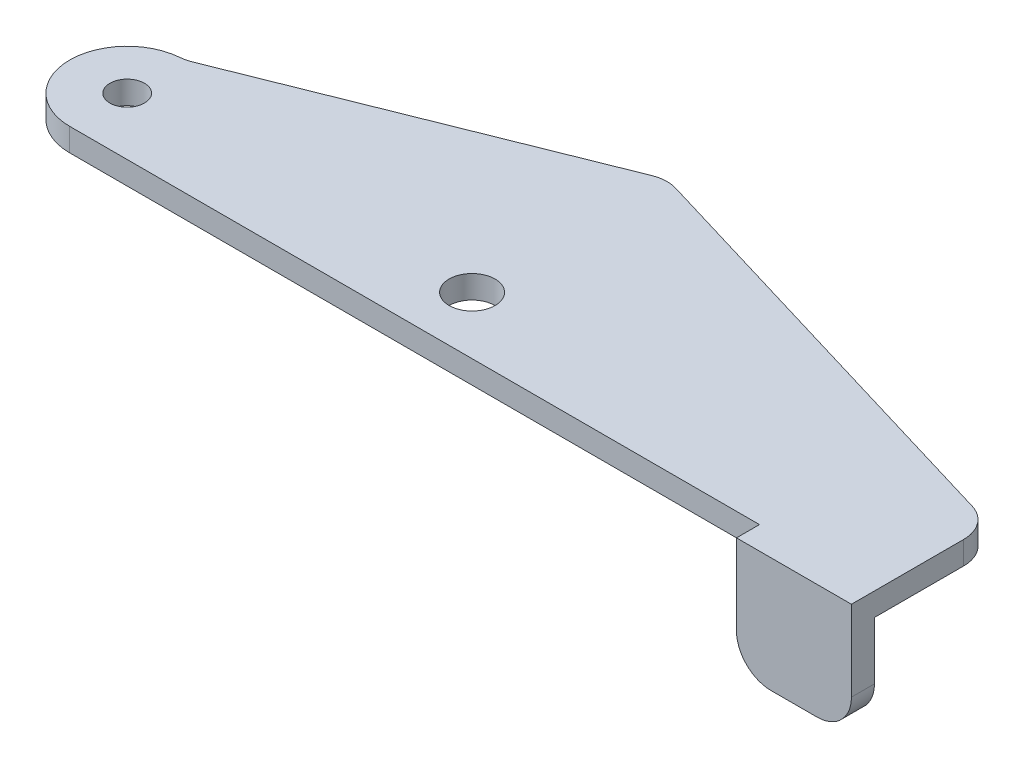
ISO-10303-21;
HEADER;
FILE_DESCRIPTION(('STEP AP214'),'2;1');
FILE_NAME('part.step','',(''),(''),'','','');
FILE_SCHEMA(('AUTOMOTIVE_DESIGN { 1 0 10303 214 1 1 1 1 }'));
ENDSEC;
DATA;
#1=APPLICATION_CONTEXT('core data for automotive mechanical design processes');
#2=APPLICATION_PROTOCOL_DEFINITION('international standard','automotive_design',2000,#1);
#3=PRODUCT_CONTEXT('',#1,'mechanical');
#4=PRODUCT('Part','Part','',(#3));
#5=PRODUCT_RELATED_PRODUCT_CATEGORY('part','',(#4));
#6=PRODUCT_DEFINITION_FORMATION('','',#4);
#7=PRODUCT_DEFINITION_CONTEXT('part definition',#1,'design');
#8=PRODUCT_DEFINITION('design','',#6,#7);
#9=PRODUCT_DEFINITION_SHAPE('','',#8);
#10=(LENGTH_UNIT() NAMED_UNIT(*) SI_UNIT(.MILLI.,.METRE.));
#11=(NAMED_UNIT(*) PLANE_ANGLE_UNIT() SI_UNIT($,.RADIAN.));
#12=(NAMED_UNIT(*) SI_UNIT($,.STERADIAN.) SOLID_ANGLE_UNIT());
#13=UNCERTAINTY_MEASURE_WITH_UNIT(LENGTH_MEASURE(1.E-05),#10,'distance_accuracy_value','');
#14=(GEOMETRIC_REPRESENTATION_CONTEXT(3) GLOBAL_UNCERTAINTY_ASSIGNED_CONTEXT((#13)) GLOBAL_UNIT_ASSIGNED_CONTEXT((#10,
#11,#12)) REPRESENTATION_CONTEXT('',''));
#15=CARTESIAN_POINT('',(0.,0.,0.));
#16=DIRECTION('',(0.,0.,1.));
#17=DIRECTION('',(1.,0.,0.));
#18=AXIS2_PLACEMENT_3D('',#15,#16,#17);
#19=CARTESIAN_POINT('',(-30.,2.,0.));
#20=DIRECTION('',(0.,1.,0.));
#21=DIRECTION('',(0.,0.,1.));
#22=AXIS2_PLACEMENT_3D('',#19,#20,#21);
#23=PLANE('',#22);
#24=CARTESIAN_POINT('',(-30.,2.,0.));
#25=DIRECTION('',(0.,1.,0.));
#26=DIRECTION('',(0.,0.,1.));
#27=AXIS2_PLACEMENT_3D('',#24,#25,#26);
#28=CIRCLE('',#27,1.5);
#29=CARTESIAN_POINT('',(-30.,2.,1.49999999999993));
#30=VERTEX_POINT('',#29);
#31=EDGE_CURVE('E181',#30,#30,#28,.T.);
#32=ORIENTED_EDGE('',*,*,#31,.F.);
#33=EDGE_LOOP('',(#32));
#34=FACE_BOUND('',#33,.T.);
#35=DIRECTION('',(0.,0.,-1.));
#36=VECTOR('',#35,1.);
#37=CARTESIAN_POINT('',(40.,2.,-5.00000000000006));
#38=LINE('',#37,#36);
#39=CARTESIAN_POINT('',(40.,2.,6.99999999999992));
#40=VERTEX_POINT('',#39);
#41=CARTESIAN_POINT('',(40.,2.,-2.76790804732689));
#42=VERTEX_POINT('',#41);
#43=EDGE_CURVE('E165',#40,#42,#38,.T.);
#44=ORIENTED_EDGE('',*,*,#43,.T.);
#45=CARTESIAN_POINT('',(37.,2.,-2.76790804732689));
#46=DIRECTION('',(0.,1.,0.));
#47=DIRECTION('',(0.,0.,1.));
#48=AXIS2_PLACEMENT_3D('',#45,#46,#47);
#49=CIRCLE('',#48,3.);
#50=CARTESIAN_POINT('',(37.862043656699,2.,-5.64138690299035));
#51=VERTEX_POINT('',#50);
#52=EDGE_CURVE('E213',#42,#51,#49,.T.);
#53=ORIENTED_EDGE('',*,*,#52,.T.);
#54=DIRECTION('',(-0.957826285221152,0.,-0.287347885566344));
#55=VECTOR('',#54,1.);
#56=CARTESIAN_POINT('',(0.,2.,-17.));
#57=LINE('',#56,#55);
#58=CARTESIAN_POINT('',(1.0034821304241,2.,-16.6989553608728));
#59=VERTEX_POINT('',#58);
#60=EDGE_CURVE('E167',#51,#59,#57,.T.);
#61=ORIENTED_EDGE('',*,*,#60,.T.);
#62=CARTESIAN_POINT('',(0.141438473725063,2.,-13.8254765052093));
#63=DIRECTION('',(0.,1.,0.));
#64=DIRECTION('',(0.,0.,1.));
#65=AXIS2_PLACEMENT_3D('',#62,#63,#64);
#66=CIRCLE('',#65,3.);
#67=CARTESIAN_POINT('',(-0.972733555337238,2.,-16.6109065778651));
#68=VERTEX_POINT('',#67);
#69=EDGE_CURVE('E211',#59,#68,#66,.T.);
#70=ORIENTED_EDGE('',*,*,#69,.T.);
#71=DIRECTION('',(-0.92847669088526,0.,0.371390676354102));
#72=VECTOR('',#71,1.);
#73=CARTESIAN_POINT('',(-30.,2.,-5.00000000000005));
#74=LINE('',#73,#72);
#75=CARTESIAN_POINT('',(-29.5281433139647,2.,-5.18874267441416));
#76=VERTEX_POINT('',#75);
#77=EDGE_CURVE('E175',#68,#76,#74,.T.);
#78=ORIENTED_EDGE('',*,*,#77,.T.);
#79=CARTESIAN_POINT('',(-30.642315343027,2.,-7.97417274706994));
#80=DIRECTION('',(0.,1.,0.));
#81=DIRECTION('',(0.,0.,1.));
#82=AXIS2_PLACEMENT_3D('',#79,#80,#81);
#83=CIRCLE('',#82,3.);
#84=CARTESIAN_POINT('',(-30.4014470893919,2.,-4.98385796691873));
#85=VERTEX_POINT('',#84);
#86=EDGE_CURVE('E217',#76,#85,#83,.F.);
#87=ORIENTED_EDGE('',*,*,#86,.T.);
#88=CARTESIAN_POINT('',(-30.,2.,0.));
#89=DIRECTION('',(0.,1.,0.));
#90=DIRECTION('',(0.,0.,1.));
#91=AXIS2_PLACEMENT_3D('',#88,#89,#90);
#92=CIRCLE('',#91,4.99999999999999);
#93=CARTESIAN_POINT('',(-30.,2.,4.99999999999992));
#94=VERTEX_POINT('',#93);
#95=EDGE_CURVE('E164',#85,#94,#92,.T.);
#96=ORIENTED_EDGE('',*,*,#95,.T.);
#97=DIRECTION('',(1.,0.,0.));
#98=VECTOR('',#97,1.);
#99=CARTESIAN_POINT('',(40.,2.,4.99999999999994));
#100=LINE('',#99,#98);
#101=CARTESIAN_POINT('',(30.,2.,4.99999999999992));
#102=VERTEX_POINT('',#101);
#103=EDGE_CURVE('E154',#94,#102,#100,.T.);
#104=ORIENTED_EDGE('',*,*,#103,.T.);
#105=DIRECTION('',(0.,0.,1.));
#106=VECTOR('',#105,1.);
#107=CARTESIAN_POINT('',(30.,2.,4.99999999999992));
#108=LINE('',#107,#106);
#109=CARTESIAN_POINT('',(30.,2.,6.99999999999992));
#110=VERTEX_POINT('',#109);
#111=EDGE_CURVE('E135',#102,#110,#108,.T.);
#112=ORIENTED_EDGE('',*,*,#111,.T.);
#113=DIRECTION('',(1.,0.,0.));
#114=VECTOR('',#113,1.);
#115=CARTESIAN_POINT('',(40.,2.,6.99999999999992));
#116=LINE('',#115,#114);
#117=EDGE_CURVE('E147',#110,#40,#116,.T.);
#118=ORIENTED_EDGE('',*,*,#117,.T.);
#119=EDGE_LOOP('',(#44,#53,#61,#70,#78,#87,#96,#104,#112,#118));
#120=FACE_BOUND('',#119,.T.);
#121=CARTESIAN_POINT('',(0.,2.,0.));
#122=DIRECTION('',(0.,1.,0.));
#123=DIRECTION('',(0.,0.,1.));
#124=AXIS2_PLACEMENT_3D('',#121,#122,#123);
#125=CIRCLE('',#124,2.);
#126=CARTESIAN_POINT('',(0.,2.,2.));
#127=VERTEX_POINT('',#126);
#128=EDGE_CURVE('E259',#127,#127,#125,.T.);
#129=ORIENTED_EDGE('',*,*,#128,.F.);
#130=EDGE_LOOP('',(#129));
#131=FACE_BOUND('',#130,.T.);
#132=ADVANCED_FACE('F35',(#34,#120,#131),#23,.T.);
#133=CARTESIAN_POINT('',(-30.,0.,0.));
#134=DIRECTION('',(0.,1.,0.));
#135=DIRECTION('',(0.,0.,1.));
#136=AXIS2_PLACEMENT_3D('',#133,#134,#135);
#137=PLANE('',#136);
#138=CARTESIAN_POINT('',(-30.,0.,0.));
#139=DIRECTION('',(0.,1.,0.));
#140=DIRECTION('',(0.,0.,1.));
#141=AXIS2_PLACEMENT_3D('',#138,#139,#140);
#142=CIRCLE('',#141,1.5);
#143=CARTESIAN_POINT('',(-30.,0.,1.49999999999993));
#144=VERTEX_POINT('',#143);
#145=EDGE_CURVE('E262',#144,#144,#142,.T.);
#146=ORIENTED_EDGE('',*,*,#145,.T.);
#147=EDGE_LOOP('',(#146));
#148=FACE_BOUND('',#147,.T.);
#149=DIRECTION('',(-0.957826285221152,0.,-0.287347885566344));
#150=VECTOR('',#149,1.);
#151=CARTESIAN_POINT('',(0.,0.,-17.));
#152=LINE('',#151,#150);
#153=CARTESIAN_POINT('',(37.862043656699,0.,-5.64138690299035));
#154=VERTEX_POINT('',#153);
#155=CARTESIAN_POINT('',(1.0034821304241,0.,-16.6989553608728));
#156=VERTEX_POINT('',#155);
#157=EDGE_CURVE('E186',#154,#156,#152,.T.);
#158=ORIENTED_EDGE('',*,*,#157,.F.);
#159=CARTESIAN_POINT('',(37.,0.,-2.76790804732689));
#160=DIRECTION('',(0.,1.,0.));
#161=DIRECTION('',(0.,0.,1.));
#162=AXIS2_PLACEMENT_3D('',#159,#160,#161);
#163=CIRCLE('',#162,3.);
#164=CARTESIAN_POINT('',(40.,0.,-2.76790804732689));
#165=VERTEX_POINT('',#164);
#166=EDGE_CURVE('E207',#154,#165,#163,.F.);
#167=ORIENTED_EDGE('',*,*,#166,.T.);
#168=DIRECTION('',(0.,0.,-1.));
#169=VECTOR('',#168,1.);
#170=CARTESIAN_POINT('',(40.,0.,-5.00000000000006));
#171=LINE('',#170,#169);
#172=CARTESIAN_POINT('',(40.,0.,4.99999999999994));
#173=VERTEX_POINT('',#172);
#174=EDGE_CURVE('E183',#173,#165,#171,.T.);
#175=ORIENTED_EDGE('',*,*,#174,.F.);
#176=DIRECTION('',(-1.,0.,0.));
#177=VECTOR('',#176,1.);
#178=CARTESIAN_POINT('',(-30.,0.,4.99999999999994));
#179=LINE('',#178,#177);
#180=CARTESIAN_POINT('',(30.,0.,4.99999999999992));
#181=VERTEX_POINT('',#180);
#182=EDGE_CURVE('E241',#173,#181,#179,.T.);
#183=ORIENTED_EDGE('',*,*,#182,.T.);
#184=DIRECTION('',(1.,0.,0.));
#185=VECTOR('',#184,1.);
#186=CARTESIAN_POINT('',(40.,0.,4.99999999999994));
#187=LINE('',#186,#185);
#188=CARTESIAN_POINT('',(-30.,0.,4.99999999999992));
#189=VERTEX_POINT('',#188);
#190=EDGE_CURVE('E157',#189,#181,#187,.T.);
#191=ORIENTED_EDGE('',*,*,#190,.F.);
#192=CARTESIAN_POINT('',(-30.,0.,0.));
#193=DIRECTION('',(0.,1.,0.));
#194=DIRECTION('',(0.,0.,1.));
#195=AXIS2_PLACEMENT_3D('',#192,#193,#194);
#196=CIRCLE('',#195,4.99999999999999);
#197=CARTESIAN_POINT('',(-30.4014470893919,0.,-4.98385796691873));
#198=VERTEX_POINT('',#197);
#199=EDGE_CURVE('E179',#198,#189,#196,.T.);
#200=ORIENTED_EDGE('',*,*,#199,.F.);
#201=CARTESIAN_POINT('',(-30.642315343027,0.,-7.97417274706994));
#202=DIRECTION('',(0.,1.,0.));
#203=DIRECTION('',(0.,0.,1.));
#204=AXIS2_PLACEMENT_3D('',#201,#202,#203);
#205=CIRCLE('',#204,3.);
#206=CARTESIAN_POINT('',(-29.5281433139647,0.,-5.18874267441416));
#207=VERTEX_POINT('',#206);
#208=EDGE_CURVE('E215',#198,#207,#205,.T.);
#209=ORIENTED_EDGE('',*,*,#208,.T.);
#210=DIRECTION('',(-0.92847669088526,0.,0.371390676354102));
#211=VECTOR('',#210,1.);
#212=CARTESIAN_POINT('',(-30.,0.,-5.00000000000005));
#213=LINE('',#212,#211);
#214=CARTESIAN_POINT('',(-0.972733555337238,0.,-16.6109065778651));
#215=VERTEX_POINT('',#214);
#216=EDGE_CURVE('E169',#215,#207,#213,.T.);
#217=ORIENTED_EDGE('',*,*,#216,.F.);
#218=CARTESIAN_POINT('',(0.141438473725063,0.,-13.8254765052093));
#219=DIRECTION('',(0.,1.,0.));
#220=DIRECTION('',(0.,0.,1.));
#221=AXIS2_PLACEMENT_3D('',#218,#219,#220);
#222=CIRCLE('',#221,3.);
#223=EDGE_CURVE('E205',#215,#156,#222,.F.);
#224=ORIENTED_EDGE('',*,*,#223,.T.);
#225=EDGE_LOOP('',(#158,#167,#175,#183,#191,#200,#209,#217,#224));
#226=FACE_BOUND('',#225,.T.);
#227=CARTESIAN_POINT('',(0.,0.,0.));
#228=DIRECTION('',(0.,1.,0.));
#229=DIRECTION('',(0.,0.,1.));
#230=AXIS2_PLACEMENT_3D('',#227,#228,#229);
#231=CIRCLE('',#230,2.);
#232=CARTESIAN_POINT('',(0.,0.,2.));
#233=VERTEX_POINT('',#232);
#234=EDGE_CURVE('E258',#233,#233,#231,.T.);
#235=ORIENTED_EDGE('',*,*,#234,.T.);
#236=EDGE_LOOP('',(#235));
#237=FACE_BOUND('',#236,.T.);
#238=ADVANCED_FACE('F269',(#148,#226,#237),#137,.F.);
#239=CARTESIAN_POINT('',(-30.,2.,0.));
#240=DIRECTION('',(0.,-1.,0.));
#241=DIRECTION('',(0.,0.,-1.));
#242=AXIS2_PLACEMENT_3D('',#239,#240,#241);
#243=CYLINDRICAL_SURFACE('',#242,4.99999999999999);
#244=ORIENTED_EDGE('',*,*,#95,.F.);
#245=DIRECTION('',(0.,-1.,0.));
#246=VECTOR('',#245,1.);
#247=CARTESIAN_POINT('',(-30.4014470893919,2.,-4.98385796691873));
#248=LINE('',#247,#246);
#249=EDGE_CURVE('E192',#85,#198,#248,.T.);
#250=ORIENTED_EDGE('',*,*,#249,.T.);
#251=ORIENTED_EDGE('',*,*,#199,.T.);
#252=DIRECTION('',(0.,-1.,0.));
#253=VECTOR('',#252,1.);
#254=CARTESIAN_POINT('',(-30.,2.,4.99999999999992));
#255=LINE('',#254,#253);
#256=EDGE_CURVE('E178',#94,#189,#255,.T.);
#257=ORIENTED_EDGE('',*,*,#256,.F.);
#258=EDGE_LOOP('',(#244,#250,#251,#257));
#259=FACE_BOUND('',#258,.T.);
#260=ADVANCED_FACE('F293',(#259),#243,.T.);
#261=CARTESIAN_POINT('',(40.,2.,4.99999999999994));
#262=DIRECTION('',(0.,0.,-1.));
#263=DIRECTION('',(-1.,0.,0.));
#264=AXIS2_PLACEMENT_3D('',#261,#262,#263);
#265=PLANE('',#264);
#266=ORIENTED_EDGE('',*,*,#190,.T.);
#267=DIRECTION('',(0.,1.,0.));
#268=VECTOR('',#267,1.);
#269=CARTESIAN_POINT('',(30.,-8.,4.99999999999992));
#270=LINE('',#269,#268);
#271=EDGE_CURVE('E139',#181,#102,#270,.T.);
#272=ORIENTED_EDGE('',*,*,#271,.T.);
#273=ORIENTED_EDGE('',*,*,#103,.F.);
#274=ORIENTED_EDGE('',*,*,#256,.T.);
#275=EDGE_LOOP('',(#266,#272,#273,#274));
#276=FACE_BOUND('',#275,.T.);
#277=ADVANCED_FACE('F152',(#276),#265,.F.);
#278=CARTESIAN_POINT('',(40.,2.,-5.00000000000006));
#279=DIRECTION('',(-1.,0.,0.));
#280=DIRECTION('',(0.,0.,1.));
#281=AXIS2_PLACEMENT_3D('',#278,#279,#280);
#282=PLANE('',#281);
#283=DIRECTION('',(0.,1.,0.));
#284=VECTOR('',#283,1.);
#285=CARTESIAN_POINT('',(40.,-8.,6.99999999999992));
#286=LINE('',#285,#284);
#287=CARTESIAN_POINT('',(40.,-5.,6.99999999999992));
#288=VERTEX_POINT('',#287);
#289=EDGE_CURVE('E233',#288,#40,#286,.T.);
#290=ORIENTED_EDGE('',*,*,#289,.F.);
#291=DIRECTION('',(0.,0.,-1.));
#292=VECTOR('',#291,1.);
#293=CARTESIAN_POINT('',(40.,-5.,4.99999999999992));
#294=LINE('',#293,#292);
#295=CARTESIAN_POINT('',(40.,-5.,4.99999999999992));
#296=VERTEX_POINT('',#295);
#297=EDGE_CURVE('E219',#288,#296,#294,.T.);
#298=ORIENTED_EDGE('',*,*,#297,.T.);
#299=DIRECTION('',(0.,1.,0.));
#300=VECTOR('',#299,1.);
#301=CARTESIAN_POINT('',(40.,-8.,4.99999999999992));
#302=LINE('',#301,#300);
#303=EDGE_CURVE('E159',#296,#173,#302,.T.);
#304=ORIENTED_EDGE('',*,*,#303,.T.);
#305=ORIENTED_EDGE('',*,*,#174,.T.);
#306=DIRECTION('',(0.,-1.,0.));
#307=VECTOR('',#306,1.);
#308=CARTESIAN_POINT('',(40.,2.,-2.76790804732689));
#309=LINE('',#308,#307);
#310=EDGE_CURVE('E209',#165,#42,#309,.F.);
#311=ORIENTED_EDGE('',*,*,#310,.T.);
#312=ORIENTED_EDGE('',*,*,#43,.F.);
#313=EDGE_LOOP('',(#290,#298,#304,#305,#311,#312));
#314=FACE_BOUND('',#313,.T.);
#315=ADVANCED_FACE('F239',(#314),#282,.F.);
#316=CARTESIAN_POINT('',(0.,2.,-17.));
#317=DIRECTION('',(-0.287347885566344,0.,0.957826285221152));
#318=DIRECTION('',(0.957826285221152,0.,0.287347885566344));
#319=AXIS2_PLACEMENT_3D('',#316,#317,#318);
#320=PLANE('',#319);
#321=ORIENTED_EDGE('',*,*,#60,.F.);
#322=DIRECTION('',(0.,-1.,0.));
#323=VECTOR('',#322,1.);
#324=CARTESIAN_POINT('',(37.862043656699,2.,-5.64138690299034));
#325=LINE('',#324,#323);
#326=EDGE_CURVE('E202',#51,#154,#325,.T.);
#327=ORIENTED_EDGE('',*,*,#326,.T.);
#328=ORIENTED_EDGE('',*,*,#157,.T.);
#329=DIRECTION('',(0.,-1.,0.));
#330=VECTOR('',#329,1.);
#331=CARTESIAN_POINT('',(1.0034821304241,2.,-16.6989553608728));
#332=LINE('',#331,#330);
#333=EDGE_CURVE('E200',#156,#59,#332,.F.);
#334=ORIENTED_EDGE('',*,*,#333,.T.);
#335=EDGE_LOOP('',(#321,#327,#328,#334));
#336=FACE_BOUND('',#335,.T.);
#337=ADVANCED_FACE('F284',(#336),#320,.F.);
#338=CARTESIAN_POINT('',(-30.,2.,-5.00000000000005));
#339=DIRECTION('',(0.371390676354102,0.,0.92847669088526));
#340=DIRECTION('',(0.92847669088526,0.,-0.371390676354102));
#341=AXIS2_PLACEMENT_3D('',#338,#339,#340);
#342=PLANE('',#341);
#343=ORIENTED_EDGE('',*,*,#216,.T.);
#344=DIRECTION('',(0.,1.,0.));
#345=VECTOR('',#344,1.);
#346=CARTESIAN_POINT('',(-29.5281433139647,2.,-5.18874267441416));
#347=LINE('',#346,#345);
#348=EDGE_CURVE('E198',#207,#76,#347,.T.);
#349=ORIENTED_EDGE('',*,*,#348,.T.);
#350=ORIENTED_EDGE('',*,*,#77,.F.);
#351=DIRECTION('',(0.,-1.,0.));
#352=VECTOR('',#351,1.);
#353=CARTESIAN_POINT('',(-0.972733555337238,2.,-16.6109065778651));
#354=LINE('',#353,#352);
#355=EDGE_CURVE('E195',#68,#215,#354,.T.);
#356=ORIENTED_EDGE('',*,*,#355,.T.);
#357=EDGE_LOOP('',(#343,#349,#350,#356));
#358=FACE_BOUND('',#357,.T.);
#359=ADVANCED_FACE('F275',(#358),#342,.F.);
#360=CARTESIAN_POINT('',(-30.,2.,0.));
#361=DIRECTION('',(0.,-1.,0.));
#362=DIRECTION('',(0.,0.,-1.));
#363=AXIS2_PLACEMENT_3D('',#360,#361,#362);
#364=CYLINDRICAL_SURFACE('',#363,1.5);
#365=ORIENTED_EDGE('',*,*,#31,.T.);
#366=EDGE_LOOP('',(#365));
#367=FACE_BOUND('',#366,.T.);
#368=ORIENTED_EDGE('',*,*,#145,.F.);
#369=EDGE_LOOP('',(#368));
#370=FACE_BOUND('',#369,.T.);
#371=ADVANCED_FACE('F272',(#367,#370),#364,.F.);
#372=CARTESIAN_POINT('',(0.,2.,0.));
#373=DIRECTION('',(0.,-1.,0.));
#374=DIRECTION('',(0.,0.,-1.));
#375=AXIS2_PLACEMENT_3D('',#372,#373,#374);
#376=CYLINDRICAL_SURFACE('',#375,2.);
#377=ORIENTED_EDGE('',*,*,#128,.T.);
#378=EDGE_LOOP('',(#377));
#379=FACE_BOUND('',#378,.T.);
#380=ORIENTED_EDGE('',*,*,#234,.F.);
#381=EDGE_LOOP('',(#380));
#382=FACE_BOUND('',#381,.T.);
#383=ADVANCED_FACE('F274',(#379,#382),#376,.F.);
#384=CARTESIAN_POINT('',(40.,-8.,4.99999999999992));
#385=DIRECTION('',(0.,0.,-1.));
#386=DIRECTION('',(-1.,0.,0.));
#387=AXIS2_PLACEMENT_3D('',#384,#385,#386);
#388=PLANE('',#387);
#389=ORIENTED_EDGE('',*,*,#303,.F.);
#390=CARTESIAN_POINT('',(37.,-5.,4.99999999999992));
#391=DIRECTION('',(0.,0.,-1.));
#392=DIRECTION('',(-1.,0.,0.));
#393=AXIS2_PLACEMENT_3D('',#390,#391,#392);
#394=CIRCLE('',#393,3.);
#395=CARTESIAN_POINT('',(37.,-8.,4.99999999999992));
#396=VERTEX_POINT('',#395);
#397=EDGE_CURVE('E224',#296,#396,#394,.T.);
#398=ORIENTED_EDGE('',*,*,#397,.T.);
#399=DIRECTION('',(-1.,0.,0.));
#400=VECTOR('',#399,1.);
#401=CARTESIAN_POINT('',(40.,-8.,4.99999999999992));
#402=LINE('',#401,#400);
#403=CARTESIAN_POINT('',(33.,-8.,4.99999999999992));
#404=VERTEX_POINT('',#403);
#405=EDGE_CURVE('E247',#396,#404,#402,.T.);
#406=ORIENTED_EDGE('',*,*,#405,.T.);
#407=CARTESIAN_POINT('',(33.,-5.,4.99999999999992));
#408=DIRECTION('',(0.,0.,-1.));
#409=DIRECTION('',(-1.,0.,0.));
#410=AXIS2_PLACEMENT_3D('',#407,#408,#409);
#411=CIRCLE('',#410,3.);
#412=CARTESIAN_POINT('',(30.,-5.,4.99999999999992));
#413=VERTEX_POINT('',#412);
#414=EDGE_CURVE('E222',#404,#413,#411,.T.);
#415=ORIENTED_EDGE('',*,*,#414,.T.);
#416=EDGE_CURVE('E158',#413,#181,#270,.T.);
#417=ORIENTED_EDGE('',*,*,#416,.T.);
#418=ORIENTED_EDGE('',*,*,#182,.F.);
#419=EDGE_LOOP('',(#389,#398,#406,#415,#417,#418));
#420=FACE_BOUND('',#419,.T.);
#421=ADVANCED_FACE('F246',(#420),#388,.T.);
#422=CARTESIAN_POINT('',(40.,-8.,6.99999999999992));
#423=DIRECTION('',(0.,0.,1.));
#424=DIRECTION('',(1.,0.,0.));
#425=AXIS2_PLACEMENT_3D('',#422,#423,#424);
#426=PLANE('',#425);
#427=DIRECTION('',(1.,0.,0.));
#428=VECTOR('',#427,1.);
#429=CARTESIAN_POINT('',(40.,-8.,6.99999999999992));
#430=LINE('',#429,#428);
#431=CARTESIAN_POINT('',(33.,-8.,6.99999999999992));
#432=VERTEX_POINT('',#431);
#433=CARTESIAN_POINT('',(37.,-8.,6.99999999999992));
#434=VERTEX_POINT('',#433);
#435=EDGE_CURVE('E235',#432,#434,#430,.T.);
#436=ORIENTED_EDGE('',*,*,#435,.T.);
#437=CARTESIAN_POINT('',(37.,-5.,6.99999999999992));
#438=DIRECTION('',(0.,0.,1.));
#439=DIRECTION('',(1.,0.,0.));
#440=AXIS2_PLACEMENT_3D('',#437,#438,#439);
#441=CIRCLE('',#440,3.);
#442=EDGE_CURVE('E43',#434,#288,#441,.T.);
#443=ORIENTED_EDGE('',*,*,#442,.T.);
#444=ORIENTED_EDGE('',*,*,#289,.T.);
#445=ORIENTED_EDGE('',*,*,#117,.F.);
#446=DIRECTION('',(0.,1.,0.));
#447=VECTOR('',#446,1.);
#448=CARTESIAN_POINT('',(30.,-8.,6.99999999999992));
#449=LINE('',#448,#447);
#450=CARTESIAN_POINT('',(30.,-5.,6.99999999999992));
#451=VERTEX_POINT('',#450);
#452=EDGE_CURVE('E142',#451,#110,#449,.T.);
#453=ORIENTED_EDGE('',*,*,#452,.F.);
#454=CARTESIAN_POINT('',(33.,-5.,6.99999999999992));
#455=DIRECTION('',(0.,0.,1.));
#456=DIRECTION('',(1.,0.,0.));
#457=AXIS2_PLACEMENT_3D('',#454,#455,#456);
#458=CIRCLE('',#457,3.);
#459=EDGE_CURVE('E50',#451,#432,#458,.T.);
#460=ORIENTED_EDGE('',*,*,#459,.T.);
#461=EDGE_LOOP('',(#436,#443,#444,#445,#453,#460));
#462=FACE_BOUND('',#461,.T.);
#463=ADVANCED_FACE('F232',(#462),#426,.T.);
#464=CARTESIAN_POINT('',(30.,-8.,4.99999999999992));
#465=DIRECTION('',(-1.,0.,0.));
#466=DIRECTION('',(0.,0.,1.));
#467=AXIS2_PLACEMENT_3D('',#464,#465,#466);
#468=PLANE('',#467);
#469=ORIENTED_EDGE('',*,*,#416,.F.);
#470=DIRECTION('',(0.,0.,1.));
#471=VECTOR('',#470,1.);
#472=CARTESIAN_POINT('',(30.,-5.,4.99999999999992));
#473=LINE('',#472,#471);
#474=EDGE_CURVE('E11',#413,#451,#473,.T.);
#475=ORIENTED_EDGE('',*,*,#474,.T.);
#476=ORIENTED_EDGE('',*,*,#452,.T.);
#477=ORIENTED_EDGE('',*,*,#111,.F.);
#478=ORIENTED_EDGE('',*,*,#271,.F.);
#479=EDGE_LOOP('',(#469,#475,#476,#477,#478));
#480=FACE_BOUND('',#479,.T.);
#481=ADVANCED_FACE('F138',(#480),#468,.T.);
#482=CARTESIAN_POINT('',(0.,-8.,0.));
#483=DIRECTION('',(0.,-1.,0.));
#484=DIRECTION('',(0.,0.,-1.));
#485=AXIS2_PLACEMENT_3D('',#482,#483,#484);
#486=PLANE('',#485);
#487=ORIENTED_EDGE('',*,*,#405,.F.);
#488=DIRECTION('',(0.,0.,-1.));
#489=VECTOR('',#488,1.);
#490=CARTESIAN_POINT('',(37.,-8.,6.99999999999992));
#491=LINE('',#490,#489);
#492=EDGE_CURVE('E57',#396,#434,#491,.F.);
#493=ORIENTED_EDGE('',*,*,#492,.T.);
#494=ORIENTED_EDGE('',*,*,#435,.F.);
#495=DIRECTION('',(0.,0.,1.));
#496=VECTOR('',#495,1.);
#497=CARTESIAN_POINT('',(33.,-8.,0.));
#498=LINE('',#497,#496);
#499=EDGE_CURVE('E226',#432,#404,#498,.F.);
#500=ORIENTED_EDGE('',*,*,#499,.T.);
#501=EDGE_LOOP('',(#487,#493,#494,#500));
#502=FACE_BOUND('',#501,.T.);
#503=ADVANCED_FACE('F250',(#502),#486,.T.);
#504=CARTESIAN_POINT('',(-30.642315343027,2.,-7.97417274706994));
#505=DIRECTION('',(0.,-1.,0.));
#506=DIRECTION('',(0.,0.,-1.));
#507=AXIS2_PLACEMENT_3D('',#504,#505,#506);
#508=CYLINDRICAL_SURFACE('',#507,3.);
#509=ORIENTED_EDGE('',*,*,#86,.F.);
#510=ORIENTED_EDGE('',*,*,#348,.F.);
#511=ORIENTED_EDGE('',*,*,#208,.F.);
#512=ORIENTED_EDGE('',*,*,#249,.F.);
#513=EDGE_LOOP('',(#509,#510,#511,#512));
#514=FACE_BOUND('',#513,.T.);
#515=ADVANCED_FACE('F307',(#514),#508,.F.);
#516=CARTESIAN_POINT('',(37.,2.,-2.76790804732689));
#517=DIRECTION('',(0.,-1.,0.));
#518=DIRECTION('',(0.,0.,-1.));
#519=AXIS2_PLACEMENT_3D('',#516,#517,#518);
#520=CYLINDRICAL_SURFACE('',#519,3.);
#521=ORIENTED_EDGE('',*,*,#52,.F.);
#522=ORIENTED_EDGE('',*,*,#310,.F.);
#523=ORIENTED_EDGE('',*,*,#166,.F.);
#524=ORIENTED_EDGE('',*,*,#326,.F.);
#525=EDGE_LOOP('',(#521,#522,#523,#524));
#526=FACE_BOUND('',#525,.T.);
#527=ADVANCED_FACE('F310',(#526),#520,.T.);
#528=CARTESIAN_POINT('',(0.141438473725063,2.,-13.8254765052093));
#529=DIRECTION('',(0.,-1.,0.));
#530=DIRECTION('',(0.,0.,-1.));
#531=AXIS2_PLACEMENT_3D('',#528,#529,#530);
#532=CYLINDRICAL_SURFACE('',#531,3.);
#533=ORIENTED_EDGE('',*,*,#69,.F.);
#534=ORIENTED_EDGE('',*,*,#333,.F.);
#535=ORIENTED_EDGE('',*,*,#223,.F.);
#536=ORIENTED_EDGE('',*,*,#355,.F.);
#537=EDGE_LOOP('',(#533,#534,#535,#536));
#538=FACE_BOUND('',#537,.T.);
#539=ADVANCED_FACE('F314',(#538),#532,.T.);
#540=CARTESIAN_POINT('',(37.,-5.,-5.00000000000006));
#541=DIRECTION('',(0.,0.,1.));
#542=DIRECTION('',(1.,0.,0.));
#543=AXIS2_PLACEMENT_3D('',#540,#541,#542);
#544=CYLINDRICAL_SURFACE('',#543,3.);
#545=ORIENTED_EDGE('',*,*,#442,.F.);
#546=ORIENTED_EDGE('',*,*,#492,.F.);
#547=ORIENTED_EDGE('',*,*,#397,.F.);
#548=ORIENTED_EDGE('',*,*,#297,.F.);
#549=EDGE_LOOP('',(#545,#546,#547,#548));
#550=FACE_BOUND('',#549,.T.);
#551=ADVANCED_FACE('F243',(#550),#544,.T.);
#552=CARTESIAN_POINT('',(33.,-5.,4.99999999999992));
#553=DIRECTION('',(0.,0.,1.));
#554=DIRECTION('',(1.,0.,0.));
#555=AXIS2_PLACEMENT_3D('',#552,#553,#554);
#556=CYLINDRICAL_SURFACE('',#555,3.);
#557=ORIENTED_EDGE('',*,*,#414,.F.);
#558=ORIENTED_EDGE('',*,*,#499,.F.);
#559=ORIENTED_EDGE('',*,*,#459,.F.);
#560=ORIENTED_EDGE('',*,*,#474,.F.);
#561=EDGE_LOOP('',(#557,#558,#559,#560));
#562=FACE_BOUND('',#561,.T.);
#563=ADVANCED_FACE('F37',(#562),#556,.T.);
#564=CLOSED_SHELL('',(#132,#238,#260,#277,#315,#337,#359,#371,#383,#421,#463,#481,#503,#515,
#527,#539,#551,#563));
#565=MANIFOLD_SOLID_BREP('B2',#564);
#566=ADVANCED_BREP_SHAPE_REPRESENTATION('',(#18,#565),#14);
#567=SHAPE_DEFINITION_REPRESENTATION(#9,#566);
ENDSEC;
END-ISO-10303-21;
